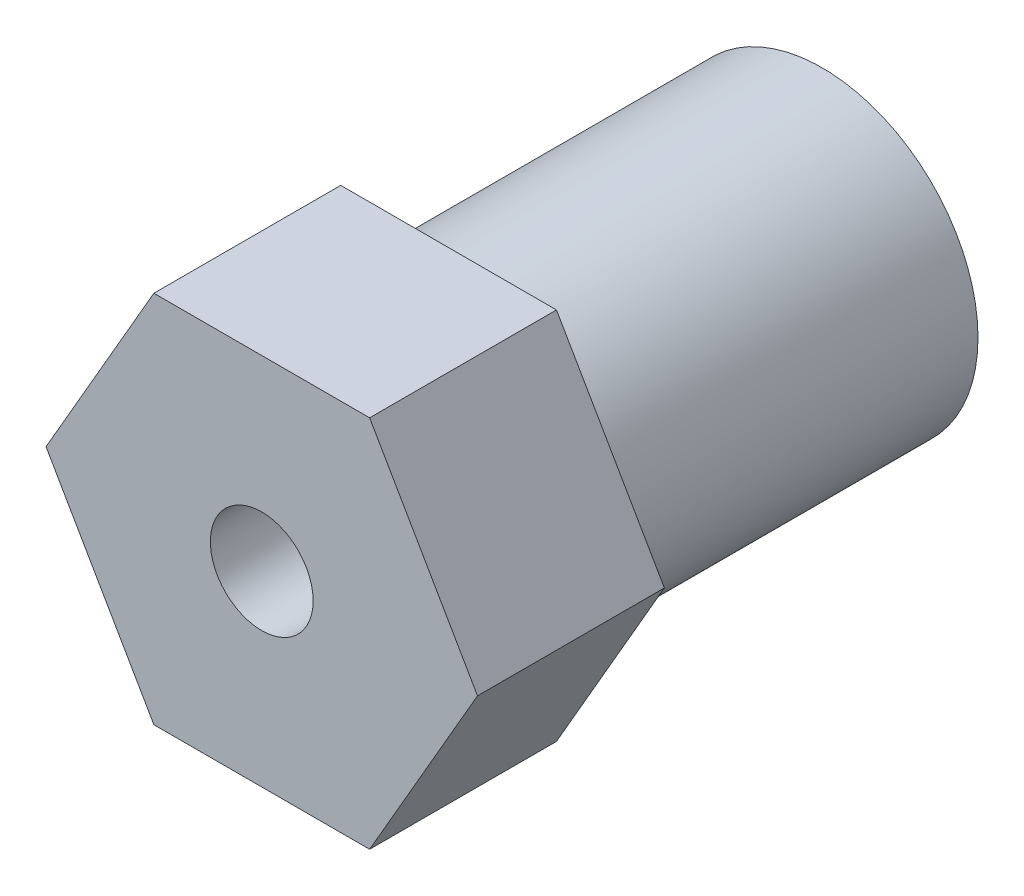
ISO-10303-21;
HEADER;
FILE_DESCRIPTION(('STEP AP214'),'2;1');
FILE_NAME('part.step','',(''),(''),'','','');
FILE_SCHEMA(('AUTOMOTIVE_DESIGN { 1 0 10303 214 1 1 1 1 }'));
ENDSEC;
DATA;
#1=APPLICATION_CONTEXT('core data for automotive mechanical design processes');
#2=APPLICATION_PROTOCOL_DEFINITION('international standard','automotive_design',2000,#1);
#3=PRODUCT_CONTEXT('',#1,'mechanical');
#4=PRODUCT('Part','Part','',(#3));
#5=PRODUCT_RELATED_PRODUCT_CATEGORY('part','',(#4));
#6=PRODUCT_DEFINITION_FORMATION('','',#4);
#7=PRODUCT_DEFINITION_CONTEXT('part definition',#1,'design');
#8=PRODUCT_DEFINITION('design','',#6,#7);
#9=PRODUCT_DEFINITION_SHAPE('','',#8);
#10=(LENGTH_UNIT() NAMED_UNIT(*) SI_UNIT(.MILLI.,.METRE.));
#11=(NAMED_UNIT(*) PLANE_ANGLE_UNIT() SI_UNIT($,.RADIAN.));
#12=(NAMED_UNIT(*) SI_UNIT($,.STERADIAN.) SOLID_ANGLE_UNIT());
#13=UNCERTAINTY_MEASURE_WITH_UNIT(LENGTH_MEASURE(1.E-05),#10,'distance_accuracy_value','');
#14=(GEOMETRIC_REPRESENTATION_CONTEXT(3) GLOBAL_UNCERTAINTY_ASSIGNED_CONTEXT((#13)) GLOBAL_UNIT_ASSIGNED_CONTEXT((#10,
#11,#12)) REPRESENTATION_CONTEXT('',''));
#15=CARTESIAN_POINT('',(0.,0.,0.));
#16=DIRECTION('',(0.,0.,1.));
#17=DIRECTION('',(1.,0.,0.));
#18=AXIS2_PLACEMENT_3D('',#15,#16,#17);
#19=CARTESIAN_POINT('',(3.46410161513782,-5.99999999999996,6.));
#20=DIRECTION('',(-0.866025403784441,0.499999999999995,0.));
#21=DIRECTION('',(-0.499999999999995,-0.866025403784442,0.));
#22=AXIS2_PLACEMENT_3D('',#19,#20,#21);
#23=PLANE('',#22);
#24=DIRECTION('',(0.499999999999995,0.866025403784442,0.));
#25=VECTOR('',#24,1.);
#26=CARTESIAN_POINT('',(3.46410161513782,-5.99999999999996,0.));
#27=LINE('',#26,#25);
#28=CARTESIAN_POINT('',(3.46410161513782,-5.99999999999996,0.));
#29=VERTEX_POINT('',#28);
#30=CARTESIAN_POINT('',(6.92820323027551,0.,0.));
#31=VERTEX_POINT('',#30);
#32=EDGE_CURVE('E126',#29,#31,#27,.T.);
#33=ORIENTED_EDGE('',*,*,#32,.T.);
#34=DIRECTION('',(0.,0.,-1.));
#35=VECTOR('',#34,1.);
#36=CARTESIAN_POINT('',(6.92820323027551,0.,6.));
#37=LINE('',#36,#35);
#38=CARTESIAN_POINT('',(6.92820323027551,0.,6.));
#39=VERTEX_POINT('',#38);
#40=EDGE_CURVE('E11',#39,#31,#37,.T.);
#41=ORIENTED_EDGE('',*,*,#40,.F.);
#42=DIRECTION('',(0.499999999999995,0.866025403784442,0.));
#43=VECTOR('',#42,1.);
#44=CARTESIAN_POINT('',(3.46410161513782,-5.99999999999996,6.));
#45=LINE('',#44,#43);
#46=CARTESIAN_POINT('',(3.46410161513782,-5.99999999999996,6.));
#47=VERTEX_POINT('',#46);
#48=EDGE_CURVE('E139',#47,#39,#45,.T.);
#49=ORIENTED_EDGE('',*,*,#48,.F.);
#50=DIRECTION('',(0.,0.,-1.));
#51=VECTOR('',#50,1.);
#52=CARTESIAN_POINT('',(3.46410161513782,-5.99999999999996,6.));
#53=LINE('',#52,#51);
#54=EDGE_CURVE('E123',#47,#29,#53,.T.);
#55=ORIENTED_EDGE('',*,*,#54,.T.);
#56=EDGE_LOOP('',(#33,#41,#49,#55));
#57=FACE_BOUND('',#56,.T.);
#58=ADVANCED_FACE('F39',(#57),#23,.F.);
#59=CARTESIAN_POINT('',(6.92820323027551,0.,6.));
#60=DIRECTION('',(-0.866025403784438,-0.500000000000001,0.));
#61=DIRECTION('',(0.500000000000001,-0.866025403784438,0.));
#62=AXIS2_PLACEMENT_3D('',#59,#60,#61);
#63=PLANE('',#62);
#64=DIRECTION('',(-0.500000000000001,0.866025403784438,0.));
#65=VECTOR('',#64,1.);
#66=CARTESIAN_POINT('',(6.92820323027551,0.,0.));
#67=LINE('',#66,#65);
#68=CARTESIAN_POINT('',(3.46410161513774,6.00000000000001,0.));
#69=VERTEX_POINT('',#68);
#70=EDGE_CURVE('E134',#31,#69,#67,.T.);
#71=ORIENTED_EDGE('',*,*,#70,.T.);
#72=DIRECTION('',(0.,0.,-1.));
#73=VECTOR('',#72,1.);
#74=CARTESIAN_POINT('',(3.46410161513774,6.00000000000001,6.));
#75=LINE('',#74,#73);
#76=CARTESIAN_POINT('',(3.46410161513774,6.00000000000001,6.));
#77=VERTEX_POINT('',#76);
#78=EDGE_CURVE('E52',#77,#69,#75,.T.);
#79=ORIENTED_EDGE('',*,*,#78,.F.);
#80=DIRECTION('',(-0.500000000000001,0.866025403784438,0.));
#81=VECTOR('',#80,1.);
#82=CARTESIAN_POINT('',(6.92820323027551,0.,6.));
#83=LINE('',#82,#81);
#84=EDGE_CURVE('E96',#39,#77,#83,.T.);
#85=ORIENTED_EDGE('',*,*,#84,.F.);
#86=ORIENTED_EDGE('',*,*,#40,.T.);
#87=EDGE_LOOP('',(#71,#79,#85,#86));
#88=FACE_BOUND('',#87,.T.);
#89=ADVANCED_FACE('F170',(#88),#63,.F.);
#90=CARTESIAN_POINT('',(3.46410161513774,6.00000000000001,6.));
#91=DIRECTION('',(0.,-1.,0.));
#92=DIRECTION('',(1.,0.,0.));
#93=AXIS2_PLACEMENT_3D('',#90,#91,#92);
#94=PLANE('',#93);
#95=DIRECTION('',(-1.,0.,0.));
#96=VECTOR('',#95,1.);
#97=CARTESIAN_POINT('',(3.46410161513774,6.00000000000001,0.));
#98=LINE('',#97,#96);
#99=CARTESIAN_POINT('',(-3.46410161513778,5.99999999999998,0.));
#100=VERTEX_POINT('',#99);
#101=EDGE_CURVE('E131',#69,#100,#98,.T.);
#102=ORIENTED_EDGE('',*,*,#101,.T.);
#103=DIRECTION('',(0.,0.,-1.));
#104=VECTOR('',#103,1.);
#105=CARTESIAN_POINT('',(-3.46410161513778,5.99999999999998,6.));
#106=LINE('',#105,#104);
#107=CARTESIAN_POINT('',(-3.46410161513778,5.99999999999998,6.));
#108=VERTEX_POINT('',#107);
#109=EDGE_CURVE('E119',#108,#100,#106,.T.);
#110=ORIENTED_EDGE('',*,*,#109,.F.);
#111=DIRECTION('',(-1.,0.,0.));
#112=VECTOR('',#111,1.);
#113=CARTESIAN_POINT('',(3.46410161513774,6.00000000000001,6.));
#114=LINE('',#113,#112);
#115=EDGE_CURVE('E111',#77,#108,#114,.T.);
#116=ORIENTED_EDGE('',*,*,#115,.F.);
#117=ORIENTED_EDGE('',*,*,#78,.T.);
#118=EDGE_LOOP('',(#102,#110,#116,#117));
#119=FACE_BOUND('',#118,.T.);
#120=ADVANCED_FACE('F150',(#119),#94,.F.);
#121=CARTESIAN_POINT('',(-3.46410161513778,5.99999999999998,6.));
#122=DIRECTION('',(0.866025403784441,-0.499999999999995,0.));
#123=DIRECTION('',(0.499999999999995,0.866025403784442,0.));
#124=AXIS2_PLACEMENT_3D('',#121,#122,#123);
#125=PLANE('',#124);
#126=DIRECTION('',(-0.499999999999995,-0.866025403784442,0.));
#127=VECTOR('',#126,1.);
#128=CARTESIAN_POINT('',(-3.46410161513778,5.99999999999998,0.));
#129=LINE('',#128,#127);
#130=CARTESIAN_POINT('',(-6.92820323027551,0.,0.));
#131=VERTEX_POINT('',#130);
#132=EDGE_CURVE('E118',#100,#131,#129,.T.);
#133=ORIENTED_EDGE('',*,*,#132,.T.);
#134=DIRECTION('',(0.,0.,-1.));
#135=VECTOR('',#134,1.);
#136=CARTESIAN_POINT('',(-6.92820323027551,0.,6.));
#137=LINE('',#136,#135);
#138=CARTESIAN_POINT('',(-6.92820323027551,0.,6.));
#139=VERTEX_POINT('',#138);
#140=EDGE_CURVE('E116',#139,#131,#137,.T.);
#141=ORIENTED_EDGE('',*,*,#140,.F.);
#142=DIRECTION('',(-0.499999999999995,-0.866025403784442,0.));
#143=VECTOR('',#142,1.);
#144=CARTESIAN_POINT('',(-3.46410161513778,5.99999999999998,6.));
#145=LINE('',#144,#143);
#146=EDGE_CURVE('E102',#108,#139,#145,.T.);
#147=ORIENTED_EDGE('',*,*,#146,.F.);
#148=ORIENTED_EDGE('',*,*,#109,.T.);
#149=EDGE_LOOP('',(#133,#141,#147,#148));
#150=FACE_BOUND('',#149,.T.);
#151=ADVANCED_FACE('F120',(#150),#125,.F.);
#152=CARTESIAN_POINT('',(-6.92820323027551,0.,6.));
#153=DIRECTION('',(0.866025403784435,0.500000000000007,0.));
#154=DIRECTION('',(-0.500000000000007,0.866025403784434,0.));
#155=AXIS2_PLACEMENT_3D('',#152,#153,#154);
#156=PLANE('',#155);
#157=DIRECTION('',(0.500000000000007,-0.866025403784434,0.));
#158=VECTOR('',#157,1.);
#159=CARTESIAN_POINT('',(-6.92820323027551,0.,0.));
#160=LINE('',#159,#158);
#161=CARTESIAN_POINT('',(-3.4641016151377,-6.00000000000003,0.));
#162=VERTEX_POINT('',#161);
#163=EDGE_CURVE('E81',#131,#162,#160,.T.);
#164=ORIENTED_EDGE('',*,*,#163,.T.);
#165=DIRECTION('',(0.,0.,-1.));
#166=VECTOR('',#165,1.);
#167=CARTESIAN_POINT('',(-3.4641016151377,-6.00000000000003,6.));
#168=LINE('',#167,#166);
#169=CARTESIAN_POINT('',(-3.4641016151377,-6.00000000000003,6.));
#170=VERTEX_POINT('',#169);
#171=EDGE_CURVE('E122',#170,#162,#168,.T.);
#172=ORIENTED_EDGE('',*,*,#171,.F.);
#173=DIRECTION('',(0.500000000000007,-0.866025403784434,0.));
#174=VECTOR('',#173,1.);
#175=CARTESIAN_POINT('',(-6.92820323027551,0.,6.));
#176=LINE('',#175,#174);
#177=EDGE_CURVE('E107',#139,#170,#176,.T.);
#178=ORIENTED_EDGE('',*,*,#177,.F.);
#179=ORIENTED_EDGE('',*,*,#140,.T.);
#180=EDGE_LOOP('',(#164,#172,#178,#179));
#181=FACE_BOUND('',#180,.T.);
#182=ADVANCED_FACE('F124',(#181),#156,.F.);
#183=CARTESIAN_POINT('',(-3.4641016151377,-6.00000000000003,6.));
#184=DIRECTION('',(0.,1.,0.));
#185=DIRECTION('',(-1.,0.,0.));
#186=AXIS2_PLACEMENT_3D('',#183,#184,#185);
#187=PLANE('',#186);
#188=DIRECTION('',(1.,0.,0.));
#189=VECTOR('',#188,1.);
#190=CARTESIAN_POINT('',(-3.4641016151377,-6.00000000000003,0.));
#191=LINE('',#190,#189);
#192=EDGE_CURVE('E86',#162,#29,#191,.T.);
#193=ORIENTED_EDGE('',*,*,#192,.T.);
#194=ORIENTED_EDGE('',*,*,#54,.F.);
#195=DIRECTION('',(1.,0.,0.));
#196=VECTOR('',#195,1.);
#197=CARTESIAN_POINT('',(-3.4641016151377,-6.00000000000003,6.));
#198=LINE('',#197,#196);
#199=EDGE_CURVE('E62',#170,#47,#198,.T.);
#200=ORIENTED_EDGE('',*,*,#199,.F.);
#201=ORIENTED_EDGE('',*,*,#171,.T.);
#202=EDGE_LOOP('',(#193,#194,#200,#201));
#203=FACE_BOUND('',#202,.T.);
#204=ADVANCED_FACE('F155',(#203),#187,.F.);
#205=CARTESIAN_POINT('',(0.,0.,6.));
#206=DIRECTION('',(0.,0.,1.));
#207=DIRECTION('',(1.,0.,0.));
#208=AXIS2_PLACEMENT_3D('',#205,#206,#207);
#209=PLANE('',#208);
#210=CARTESIAN_POINT('',(0.,0.,6.));
#211=DIRECTION('',(0.,0.,1.));
#212=DIRECTION('',(1.,0.,0.));
#213=AXIS2_PLACEMENT_3D('',#210,#211,#212);
#214=CIRCLE('',#213,1.65);
#215=CARTESIAN_POINT('',(1.65,0.,6.));
#216=VERTEX_POINT('',#215);
#217=EDGE_CURVE('E277',#216,#216,#214,.T.);
#218=ORIENTED_EDGE('',*,*,#217,.F.);
#219=EDGE_LOOP('',(#218));
#220=FACE_BOUND('',#219,.T.);
#221=ORIENTED_EDGE('',*,*,#48,.T.);
#222=ORIENTED_EDGE('',*,*,#84,.T.);
#223=ORIENTED_EDGE('',*,*,#115,.T.);
#224=ORIENTED_EDGE('',*,*,#146,.T.);
#225=ORIENTED_EDGE('',*,*,#177,.T.);
#226=ORIENTED_EDGE('',*,*,#199,.T.);
#227=EDGE_LOOP('',(#221,#222,#223,#224,#225,#226));
#228=FACE_BOUND('',#227,.T.);
#229=ADVANCED_FACE('F110',(#220,#228),#209,.T.);
#230=CARTESIAN_POINT('',(0.,0.,0.));
#231=DIRECTION('',(0.,0.,1.));
#232=DIRECTION('',(1.,0.,0.));
#233=AXIS2_PLACEMENT_3D('',#230,#231,#232);
#234=PLANE('',#233);
#235=CARTESIAN_POINT('',(0.,0.,0.));
#236=DIRECTION('',(0.,0.,1.));
#237=DIRECTION('',(1.,0.,0.));
#238=AXIS2_PLACEMENT_3D('',#235,#236,#237);
#239=CIRCLE('',#238,5.);
#240=CARTESIAN_POINT('',(5.,0.,0.));
#241=VERTEX_POINT('',#240);
#242=EDGE_CURVE('E290',#241,#241,#239,.T.);
#243=ORIENTED_EDGE('',*,*,#242,.T.);
#244=EDGE_LOOP('',(#243));
#245=FACE_BOUND('',#244,.T.);
#246=ORIENTED_EDGE('',*,*,#32,.F.);
#247=ORIENTED_EDGE('',*,*,#192,.F.);
#248=ORIENTED_EDGE('',*,*,#163,.F.);
#249=ORIENTED_EDGE('',*,*,#132,.F.);
#250=ORIENTED_EDGE('',*,*,#101,.F.);
#251=ORIENTED_EDGE('',*,*,#70,.F.);
#252=EDGE_LOOP('',(#246,#247,#248,#249,#250,#251));
#253=FACE_BOUND('',#252,.T.);
#254=ADVANCED_FACE('F148',(#245,#253),#234,.F.);
#255=CARTESIAN_POINT('',(0.,0.,-12.));
#256=DIRECTION('',(0.,0.,1.));
#257=DIRECTION('',(1.,0.,0.));
#258=AXIS2_PLACEMENT_3D('',#255,#256,#257);
#259=CYLINDRICAL_SURFACE('',#258,5.);
#260=CARTESIAN_POINT('',(0.,-5.,-7.75));
#261=CARTESIAN_POINT('',(-0.0690634072247758,-4.99999883223344,-7.75000193811513));
#262=CARTESIAN_POINT('',(-0.138148464858969,-4.99855481776523,-7.75574295897816));
#263=CARTESIAN_POINT('',(-0.27433860314211,-4.99293428191577,-7.7785209594225));
#264=CARTESIAN_POINT('',(-0.341442539058949,-4.98875621183307,-7.79556434128154));
#265=CARTESIAN_POINT('',(-0.471684060152147,-4.97813021943366,-7.84036604455174));
#266=CARTESIAN_POINT('',(-0.534826302858336,-4.97168502368406,-7.8681114989294));
#267=CARTESIAN_POINT('',(-0.655560109920355,-4.95721119839661,-7.93348449170403));
#268=CARTESIAN_POINT('',(-0.7131514869573,-4.94918251545042,-7.97111236343245));
#269=CARTESIAN_POINT('',(-0.822334939417433,-4.93222844659834,-8.05600065804517));
#270=CARTESIAN_POINT('',(-0.873796408384226,-4.92328922623777,-8.10342631246598));
#271=CARTESIAN_POINT('',(-0.968124106002753,-4.90561350097941,-8.20621017075743));
#272=CARTESIAN_POINT('',(-1.01098936412428,-4.89687701906957,-8.26156926912208));
#273=CARTESIAN_POINT('',(-1.08752211899919,-4.88045646416425,-8.37966268894787));
#274=CARTESIAN_POINT('',(-1.12104351327113,-4.87278995392171,-8.44249435900867));
#275=CARTESIAN_POINT('',(-1.17699742379211,-4.85957912343519,-8.57312367638197));
#276=CARTESIAN_POINT('',(-1.19943171286611,-4.85403446393991,-8.64092052777147));
#277=CARTESIAN_POINT('',(-1.23212903067024,-4.84583730597959,-8.7781195818354));
#278=CARTESIAN_POINT('',(-1.24262689027778,-4.84312909229522,-8.84746241337483));
#279=CARTESIAN_POINT('',(-1.25188481255654,-4.84074468781451,-8.98697380751165));
#280=CARTESIAN_POINT('',(-1.25064678484831,-4.8410680037387,-9.05714223391551));
#281=CARTESIAN_POINT('',(-1.2366554371994,-4.84466004580515,-9.1945131731204));
#282=CARTESIAN_POINT('',(-1.22418195015877,-4.84785719168233,-9.26174635122092));
#283=CARTESIAN_POINT('',(-1.18852015575259,-4.85672258063736,-9.39313420909275));
#284=CARTESIAN_POINT('',(-1.16533108505785,-4.8623909997558,-9.45728866919082));
#285=CARTESIAN_POINT('',(-1.10865789828096,-4.87562594920156,-9.58144834687672));
#286=CARTESIAN_POINT('',(-1.07507222269409,-4.88321106224518,-9.64140514315796));
#287=CARTESIAN_POINT('',(-0.998630230012461,-4.89941425705322,-9.7549322581307));
#288=CARTESIAN_POINT('',(-0.955772290674032,-4.90803251945613,-9.80850145672271));
#289=CARTESIAN_POINT('',(-0.860552853901015,-4.92563233783151,-9.909336346412));
#290=CARTESIAN_POINT('',(-0.807955215138216,-4.93461724564976,-9.95637874171779));
#291=CARTESIAN_POINT('',(-0.695509931253083,-4.95171637982321,-10.0410177020533));
#292=CARTESIAN_POINT('',(-0.635662064756619,-4.95983057957846,-10.078613978553));
#293=CARTESIAN_POINT('',(-0.510096573901159,-4.97431443411819,-10.1433754885203));
#294=CARTESIAN_POINT('',(-0.444359494340519,-4.98067800106438,-10.170504450212));
#295=CARTESIAN_POINT('',(-0.309063340119069,-4.99089930826182,-10.2132644214246));
#296=CARTESIAN_POINT('',(-0.239504999292071,-4.99475752782734,-10.2288976303484));
#297=CARTESIAN_POINT('',(-0.100449975325022,-4.99946249392812,-10.2478813046324));
#298=CARTESIAN_POINT('',(-0.0309972666568413,-5.00038377923565,-10.2515358550628));
#299=CARTESIAN_POINT('',(0.107527395667924,-4.99932337345376,-10.2472924982871));
#300=CARTESIAN_POINT('',(0.176599383037163,-4.99734194368205,-10.2393956310007));
#301=CARTESIAN_POINT('',(0.31134522398041,-4.99074650939464,-10.2125242430072));
#302=CARTESIAN_POINT('',(0.377054265807296,-4.98617195154843,-10.1937156137692));
#303=CARTESIAN_POINT('',(0.50438107704376,-4.97490588861778,-10.145744096643));
#304=CARTESIAN_POINT('',(0.565998432527196,-4.9682141697491,-10.1165801630724));
#305=CARTESIAN_POINT('',(0.684602612024873,-4.95327756605259,-10.0481365592711));
#306=CARTESIAN_POINT('',(0.741487868196525,-4.94500722805777,-10.0086865730027));
#307=CARTESIAN_POINT('',(0.847938844702705,-4.92787090989516,-9.92100840933586));
#308=CARTESIAN_POINT('',(0.897503299144173,-4.91900482709754,-9.87277871698591));
#309=CARTESIAN_POINT('',(0.989158806727275,-4.90140797467309,-9.76749836596295));
#310=CARTESIAN_POINT('',(1.03103655635169,-4.89268586822734,-9.71026024749798));
#311=CARTESIAN_POINT('',(1.10459229917725,-4.87660731981032,-9.58938947127857));
#312=CARTESIAN_POINT('',(1.13627074513161,-4.86925081722522,-9.52575709753354));
#313=CARTESIAN_POINT('',(1.18829285050774,-4.85681745612221,-9.39424523132243));
#314=CARTESIAN_POINT('',(1.20870366387839,-4.85172712743255,-9.32639364304666));
#315=CARTESIAN_POINT('',(1.23778804996148,-4.84438953408486,-9.18807530175907));
#316=CARTESIAN_POINT('',(1.24646418956555,-4.84214164766613,-9.11760912413959));
#317=CARTESIAN_POINT('',(1.25169882527833,-4.84079084336631,-8.97823248012066));
#318=CARTESIAN_POINT('',(1.2485982481501,-4.8415994394022,-8.90933547072939));
#319=CARTESIAN_POINT('',(1.23114773192739,-4.84606590839869,-8.77308009277668));
#320=CARTESIAN_POINT('',(1.21679801890564,-4.84972372409881,-8.70572169332196));
#321=CARTESIAN_POINT('',(1.17744276620233,-4.85942717235602,-8.57482628411216));
#322=CARTESIAN_POINT('',(1.15250117056698,-4.86545846030258,-8.51126891229983));
#323=CARTESIAN_POINT('',(1.09272076133756,-4.8792312977069,-8.38919551440526));
#324=CARTESIAN_POINT('',(1.05788057502849,-4.88697308433977,-8.3306801890109));
#325=CARTESIAN_POINT('',(0.97822312386428,-4.90354695219593,-8.21870447583165));
#326=CARTESIAN_POINT('',(0.933169302426879,-4.91240220693131,-8.1654157721467));
#327=CARTESIAN_POINT('',(0.834824475991446,-4.93006689371905,-8.06704412933716));
#328=CARTESIAN_POINT('',(0.781531517717621,-4.93887631439216,-8.02196314157252));
#329=CARTESIAN_POINT('',(0.667056322252157,-4.95564713039719,-7.94049057619616));
#330=CARTESIAN_POINT('',(0.605748685263654,-4.9635902780489,-7.90427115527368));
#331=CARTESIAN_POINT('',(0.477721716258729,-4.97754104145932,-7.84271044754956));
#332=CARTESIAN_POINT('',(0.411006302863949,-4.98355004333151,-7.81736136612622));
#333=CARTESIAN_POINT('',(0.287008544369559,-4.99206716304618,-7.78202347472529));
#334=CARTESIAN_POINT('',(0.230316809090057,-4.99502154210576,-7.77004063078881));
#335=CARTESIAN_POINT('',(0.115755059613569,-4.9989883769329,-7.75402838031505));
#336=CARTESIAN_POINT('',(0.0578851343688469,-5.00000097875745,-7.74999837557891));
#337=CARTESIAN_POINT('',(0.,-5.,-7.75));
#338=B_SPLINE_CURVE_WITH_KNOTS('',3,(#260,#261,#262,#263,#264,#265,#266,#267,#268,#269,#270,
#271,#272,#273,#274,#275,#276,#277,#278,#279,#280,#281,#282,#283,#284,#285,#286,#287,#288,#289,
#290,#291,#292,#293,#294,#295,#296,#297,#298,#299,#300,#301,#302,#303,#304,#305,#306,#307,#308,
#309,#310,#311,#312,#313,#314,#315,#316,#317,#318,#319,#320,#321,#322,#323,#324,#325,#326,#327,
#328,#329,#330,#331,#332,#333,#334,#335,#336,#337),.UNSPECIFIED.,.T.,.F.,(4,2,2,2,2,2,2,2,2,2,2,
2,2,2,2,2,2,2,2,2,2,2,2,2,2,2,2,2,2,2,2,2,2,2,2,2,2,2,4),(0.,0.206978093726575,
0.414073531469916,0.620920751905088,0.827774950141107,1.03845362864282,1.24915607983385,
1.46298872954839,1.6767871764114,1.88630245916192,2.09578365093914,2.30018747505849,
2.50460586221699,2.71108773228233,2.91760575696802,3.13001250807516,3.34242574631873,
3.55556857507595,3.76867061407202,3.97631924124397,4.18394917593952,4.38850228761698,
4.59307606101909,4.80127989637793,5.00951969173349,5.2228709100373,5.4362126562459,
5.6482687884503,5.8602785271034,6.06619816998844,6.27211367463362,6.47680333799539,
6.68152140114084,6.89157980341592,7.10168808142015,7.3156015458299,7.52936136517792,
7.70285202451791,7.876329633692),.UNSPECIFIED.);
#339=CARTESIAN_POINT('',(0.,-5.,-7.75));
#340=VERTEX_POINT('',#339);
#341=EDGE_CURVE('E269',#340,#340,#338,.T.);
#342=ORIENTED_EDGE('',*,*,#341,.F.);
#343=EDGE_LOOP('',(#342));
#344=FACE_BOUND('',#343,.T.);
#345=CARTESIAN_POINT('',(0.,0.,-12.));
#346=DIRECTION('',(0.,0.,1.));
#347=DIRECTION('',(1.,0.,0.));
#348=AXIS2_PLACEMENT_3D('',#345,#346,#347);
#349=CIRCLE('',#348,5.);
#350=CARTESIAN_POINT('',(5.,0.,-12.));
#351=VERTEX_POINT('',#350);
#352=EDGE_CURVE('E132',#351,#351,#349,.T.);
#353=ORIENTED_EDGE('',*,*,#352,.T.);
#354=EDGE_LOOP('',(#353));
#355=FACE_BOUND('',#354,.T.);
#356=ORIENTED_EDGE('',*,*,#242,.F.);
#357=EDGE_LOOP('',(#356));
#358=FACE_BOUND('',#357,.T.);
#359=ADVANCED_FACE('F210',(#344,#355,#358),#259,.T.);
#360=CARTESIAN_POINT('',(0.,0.,-12.));
#361=DIRECTION('',(0.,0.,1.));
#362=DIRECTION('',(1.,0.,0.));
#363=AXIS2_PLACEMENT_3D('',#360,#361,#362);
#364=PLANE('',#363);
#365=CARTESIAN_POINT('',(0.,0.,-12.));
#366=DIRECTION('',(0.,0.,1.));
#367=DIRECTION('',(1.,0.,0.));
#368=AXIS2_PLACEMENT_3D('',#365,#366,#367);
#369=CIRCLE('',#368,2.5);
#370=CARTESIAN_POINT('',(2.5,0.,-12.));
#371=VERTEX_POINT('',#370);
#372=EDGE_CURVE('E285',#371,#371,#369,.T.);
#373=ORIENTED_EDGE('',*,*,#372,.T.);
#374=EDGE_LOOP('',(#373));
#375=FACE_BOUND('',#374,.T.);
#376=ORIENTED_EDGE('',*,*,#352,.F.);
#377=EDGE_LOOP('',(#376));
#378=FACE_BOUND('',#377,.T.);
#379=ADVANCED_FACE('F218',(#375,#378),#364,.F.);
#380=CARTESIAN_POINT('',(0.,0.,-12.));
#381=DIRECTION('',(0.,0.,1.));
#382=DIRECTION('',(1.,0.,0.));
#383=AXIS2_PLACEMENT_3D('',#380,#381,#382);
#384=CYLINDRICAL_SURFACE('',#383,2.5);
#385=CARTESIAN_POINT('',(0.,-2.5,-7.75));
#386=CARTESIAN_POINT('',(-0.0657149536912331,-2.49999641755189,-7.75000412789937));
#387=CARTESIAN_POINT('',(-0.131508249622541,-2.49738113774397,-7.75521259140209));
#388=CARTESIAN_POINT('',(-0.261150294085531,-2.48717695046745,-7.77581610042615));
#389=CARTESIAN_POINT('',(-0.324995108391879,-2.47957859786229,-7.79123049124706));
#390=CARTESIAN_POINT('',(-0.448666931100718,-2.46020349254139,-7.83149226077099));
#391=CARTESIAN_POINT('',(-0.508508503673975,-2.448442989719,-7.85630298031001));
#392=CARTESIAN_POINT('',(-0.623090771008206,-2.42182220644723,-7.91446327670617));
#393=CARTESIAN_POINT('',(-0.677831867487562,-2.40696217041913,-7.94781218031106));
#394=CARTESIAN_POINT('',(-0.784384772202399,-2.37445322822571,-8.02439656185662));
#395=CARTESIAN_POINT('',(-0.83581901390264,-2.3566899890942,-8.06810809904955));
#396=CARTESIAN_POINT('',(-0.930974306083722,-2.3207496280843,-8.16315184905879));
#397=CARTESIAN_POINT('',(-0.974689478883458,-2.30257220261294,-8.21448981471555));
#398=CARTESIAN_POINT('',(-1.05656500056285,-2.26623688996684,-8.32810418690423));
#399=CARTESIAN_POINT('',(-1.09403166943955,-2.24818983712665,-8.39092012293239));
#400=CARTESIAN_POINT('',(-1.15771028361337,-2.21607473465401,-8.52295916998277));
#401=CARTESIAN_POINT('',(-1.18393026870792,-2.20200384508737,-8.59217766090344));
#402=CARTESIAN_POINT('',(-1.22266555273574,-2.18072333797261,-8.7308313817774));
#403=CARTESIAN_POINT('',(-1.23590732135055,-2.17315339479642,-8.80000556508424));
#404=CARTESIAN_POINT('',(-1.25053374163606,-2.1647736243566,-8.93997354722435));
#405=CARTESIAN_POINT('',(-1.25193011046634,-2.1639571167911,-9.01076567608894));
#406=CARTESIAN_POINT('',(-1.24335910896537,-2.16888662821561,-9.14285753039421));
#407=CARTESIAN_POINT('',(-1.23473069942103,-2.17385954577517,-9.20428003902881));
#408=CARTESIAN_POINT('',(-1.20867481132117,-2.18845285917313,-9.3246523867163));
#409=CARTESIAN_POINT('',(-1.19124452987206,-2.1980747353972,-9.38360143163164));
#410=CARTESIAN_POINT('',(-1.1477622254825,-2.22109345515926,-9.49903641570707));
#411=CARTESIAN_POINT('',(-1.12151883389499,-2.23457300829998,-9.55543299848223));
#412=CARTESIAN_POINT('',(-1.061302109585,-2.26379255351754,-9.66329286573751));
#413=CARTESIAN_POINT('',(-1.02732530476558,-2.27953355975238,-9.71475391950011));
#414=CARTESIAN_POINT('',(-0.947582568640986,-2.31391447379107,-9.81815156592903));
#415=CARTESIAN_POINT('',(-0.900868072961603,-2.33266887795933,-9.8693210919702));
#416=CARTESIAN_POINT('',(-0.799444473426717,-2.36934529125509,-9.96341927323863));
#417=CARTESIAN_POINT('',(-0.744731570717857,-2.38726689948501,-10.0063439900424));
#418=CARTESIAN_POINT('',(-0.62564563228981,-2.42127484103705,-10.0846070762872));
#419=CARTESIAN_POINT('',(-0.56094198949926,-2.43723730202509,-10.1195005905572));
#420=CARTESIAN_POINT('',(-0.425582769360995,-2.46447351401553,-10.1776212863038));
#421=CARTESIAN_POINT('',(-0.354931970331595,-2.47575098679441,-10.200857731269));
#422=CARTESIAN_POINT('',(-0.215958114575876,-2.49155417176795,-10.2330942546458));
#423=CARTESIAN_POINT('',(-0.147926913185405,-2.4965617287664,-10.2431140446835));
#424=CARTESIAN_POINT('',(-0.0109744999366916,-2.50091266823877,-10.2518309139181));
#425=CARTESIAN_POINT('',(0.0579462748373771,-2.5002587340164,-10.2505333570493));
#426=CARTESIAN_POINT('',(0.189041214982492,-2.49363990316801,-10.2372416394766));
#427=CARTESIAN_POINT('',(0.251324260062443,-2.48809057110237,-10.2260843340875));
#428=CARTESIAN_POINT('',(0.373008615377396,-2.47277714143524,-10.1947024101311));
#429=CARTESIAN_POINT('',(0.432409607113746,-2.46301257917916,-10.1744767919333));
#430=CARTESIAN_POINT('',(0.548610760562082,-2.43980314267087,-10.1250019169585));
#431=CARTESIAN_POINT('',(0.605287996257692,-2.42626102212424,-10.095511187354));
#432=CARTESIAN_POINT('',(0.713076702123651,-2.39679967896386,-10.0286155804424));
#433=CARTESIAN_POINT('',(0.764185787219102,-2.38087944457231,-9.99120733175821));
#434=CARTESIAN_POINT('',(0.864709611613316,-2.34635276671831,-9.90529946833391));
#435=CARTESIAN_POINT('',(0.913465097280799,-2.32763606060552,-9.85607141443304));
#436=CARTESIAN_POINT('',(1.00232040139155,-2.29077989504843,-9.75009356091337));
#437=CARTESIAN_POINT('',(1.04241423211355,-2.27264084226908,-9.69333860147953));
#438=CARTESIAN_POINT('',(1.11463489312212,-2.23813990282585,-9.57044543224961));
#439=CARTESIAN_POINT('',(1.1462818698483,-2.2219066207934,-9.50398591723926));
#440=CARTESIAN_POINT('',(1.19760353251725,-2.19467590460158,-9.36561241538435));
#441=CARTESIAN_POINT('',(1.21729364485946,-2.18367172800773,-9.29370559187352));
#442=CARTESIAN_POINT('',(1.2423271093121,-2.16951876260833,-9.15386222142319));
#443=CARTESIAN_POINT('',(1.24886624550108,-2.16571729325614,-9.08620718321371));
#444=CARTESIAN_POINT('',(1.25086144297598,-2.16456693307719,-8.95069116603659));
#445=CARTESIAN_POINT('',(1.2463223082805,-2.16721524534441,-8.88283028907571));
#446=CARTESIAN_POINT('',(1.22740765699033,-2.17797327562531,-8.75564562308498));
#447=CARTESIAN_POINT('',(1.2140103929285,-2.18553868102992,-8.6961244123195));
#448=CARTESIAN_POINT('',(1.17896919778081,-2.20463770234897,-8.58023985071912));
#449=CARTESIAN_POINT('',(1.15732261394976,-2.21617259462094,-8.52387752238504));
#450=CARTESIAN_POINT('',(1.10476968162585,-2.2428566295566,-8.41171893626674));
#451=CARTESIAN_POINT('',(1.07333892227057,-2.25819652995238,-8.35621512271288));
#452=CARTESIAN_POINT('',(1.00268871454579,-2.29044164543238,-8.25090682977427));
#453=CARTESIAN_POINT('',(0.963465214048311,-2.30734767243153,-8.20110533685189));
#454=CARTESIAN_POINT('',(0.872754158330802,-2.34327903949141,-8.10232252205298));
#455=CARTESIAN_POINT('',(0.820355528762715,-2.36231229139336,-8.0541761220476));
#456=CARTESIAN_POINT('',(0.70769350777535,-2.3984719031886,-7.96717127072046));
#457=CARTESIAN_POINT('',(0.647425904070982,-2.4155972326005,-7.92831782571714));
#458=CARTESIAN_POINT('',(0.519914496024934,-2.44622511981379,-7.86095454654725));
#459=CARTESIAN_POINT('',(0.452624379918268,-2.45970120703636,-7.83251978823571));
#460=CARTESIAN_POINT('',(0.313427626617739,-2.48126676704332,-7.78773979010131));
#461=CARTESIAN_POINT('',(0.241534749528958,-2.48937154216165,-7.77136019146303));
#462=CARTESIAN_POINT('',(0.14075243310423,-2.49619327387079,-7.75762823615519));
#463=CARTESIAN_POINT('',(0.112702349299373,-2.49761706674002,-7.75477169892048));
#464=CARTESIAN_POINT('',(0.0564396647589471,-2.49952121222331,-7.75095666810399));
#465=CARTESIAN_POINT('',(0.0282270595592268,-2.50000153879704,-7.749998226911));
#466=CARTESIAN_POINT('',(0.,-2.5,-7.75));
#467=B_SPLINE_CURVE_WITH_KNOTS('',3,(#385,#386,#387,#388,#389,#390,#391,#392,#393,#394,#395,
#396,#397,#398,#399,#400,#401,#402,#403,#404,#405,#406,#407,#408,#409,#410,#411,#412,#413,#414,
#415,#416,#417,#418,#419,#420,#421,#422,#423,#424,#425,#426,#427,#428,#429,#430,#431,#432,#433,
#434,#435,#436,#437,#438,#439,#440,#441,#442,#443,#444,#445,#446,#447,#448,#449,#450,#451,#452,
#453,#454,#455,#456,#457,#458,#459,#460,#461,#462,#463,#464,#465,#466),.UNSPECIFIED.,.T.,.F.,(4,
2,2,2,2,2,2,2,2,2,2,2,2,2,2,2,2,2,2,2,2,2,2,2,2,2,2,2,2,2,2,2,2,2,2,2,2,2,2,2,4),(0.,
0.197030321775366,0.394435187136497,0.591077694365372,0.78770470072696,0.996227198397611,
1.20490779706754,1.42977158038441,1.65447434872851,1.86572515175287,2.07676696661276,
2.26257140511651,2.44843504907098,2.63862800210609,2.82890651575277,3.04331176667348,
3.25781918248358,3.48228777768051,3.7065777114035,3.91229113089182,4.11790705639345,
4.30758633132653,4.49728652038664,4.69241070034873,4.88761813435424,5.10199513305524,
5.3165198576929,5.54143352699593,5.76605639925972,5.96911634372967,6.17208824825007,
6.35572412805229,6.53941910979597,6.73545570969518,6.93159451423697,7.15156553440623,
7.37165479220716,7.59330017078656,7.81431135781163,7.89894100172122,7.98357298143558),.UNSPECIFIED.);
#468=CARTESIAN_POINT('',(0.,-2.5,-7.75));
#469=VERTEX_POINT('',#468);
#470=EDGE_CURVE('E45',#469,#469,#467,.T.);
#471=ORIENTED_EDGE('',*,*,#470,.T.);
#472=EDGE_LOOP('',(#471));
#473=FACE_BOUND('',#472,.T.);
#474=ORIENTED_EDGE('',*,*,#372,.F.);
#475=EDGE_LOOP('',(#474));
#476=FACE_BOUND('',#475,.T.);
#477=CARTESIAN_POINT('',(0.,0.,0.));
#478=DIRECTION('',(0.,0.,1.));
#479=DIRECTION('',(1.,0.,0.));
#480=AXIS2_PLACEMENT_3D('',#477,#478,#479);
#481=CIRCLE('',#480,2.5);
#482=CARTESIAN_POINT('',(2.5,0.,0.));
#483=VERTEX_POINT('',#482);
#484=EDGE_CURVE('E283',#483,#483,#481,.T.);
#485=ORIENTED_EDGE('',*,*,#484,.T.);
#486=EDGE_LOOP('',(#485));
#487=FACE_BOUND('',#486,.T.);
#488=ADVANCED_FACE('F227',(#473,#476,#487),#384,.F.);
#489=CARTESIAN_POINT('',(0.,0.,0.));
#490=DIRECTION('',(0.,0.,1.));
#491=DIRECTION('',(1.,0.,0.));
#492=AXIS2_PLACEMENT_3D('',#489,#490,#491);
#493=PLANE('',#492);
#494=CARTESIAN_POINT('',(0.,0.,0.));
#495=DIRECTION('',(0.,0.,1.));
#496=DIRECTION('',(1.,0.,0.));
#497=AXIS2_PLACEMENT_3D('',#494,#495,#496);
#498=CIRCLE('',#497,1.65);
#499=CARTESIAN_POINT('',(1.65,0.,0.));
#500=VERTEX_POINT('',#499);
#501=EDGE_CURVE('E273',#500,#500,#498,.T.);
#502=ORIENTED_EDGE('',*,*,#501,.T.);
#503=EDGE_LOOP('',(#502));
#504=FACE_BOUND('',#503,.T.);
#505=ORIENTED_EDGE('',*,*,#484,.F.);
#506=EDGE_LOOP('',(#505));
#507=FACE_BOUND('',#506,.T.);
#508=ADVANCED_FACE('F236',(#504,#507),#493,.F.);
#509=CARTESIAN_POINT('',(0.,0.,6.));
#510=DIRECTION('',(0.,0.,-1.));
#511=DIRECTION('',(-1.,0.,0.));
#512=AXIS2_PLACEMENT_3D('',#509,#510,#511);
#513=CYLINDRICAL_SURFACE('',#512,1.65);
#514=ORIENTED_EDGE('',*,*,#217,.T.);
#515=EDGE_LOOP('',(#514));
#516=FACE_BOUND('',#515,.T.);
#517=ORIENTED_EDGE('',*,*,#501,.F.);
#518=EDGE_LOOP('',(#517));
#519=FACE_BOUND('',#518,.T.);
#520=ADVANCED_FACE('F244',(#516,#519),#513,.F.);
#521=CARTESIAN_POINT('',(0.,-5.1,-9.));
#522=DIRECTION('',(0.,1.,0.));
#523=DIRECTION('',(0.,0.,1.));
#524=AXIS2_PLACEMENT_3D('',#521,#522,#523);
#525=CYLINDRICAL_SURFACE('',#524,1.25);
#526=ORIENTED_EDGE('',*,*,#341,.T.);
#527=EDGE_LOOP('',(#526));
#528=FACE_BOUND('',#527,.T.);
#529=ORIENTED_EDGE('',*,*,#470,.F.);
#530=EDGE_LOOP('',(#529));
#531=FACE_BOUND('',#530,.T.);
#532=ADVANCED_FACE('F251',(#528,#531),#525,.F.);
#533=CLOSED_SHELL('',(#58,#89,#120,#151,#182,#204,#229,#254,#359,#379,#488,#508,#520,#532));
#534=MANIFOLD_SOLID_BREP('B2',#533);
#535=ADVANCED_BREP_SHAPE_REPRESENTATION('',(#18,#534),#14);
#536=SHAPE_DEFINITION_REPRESENTATION(#9,#535);
ENDSEC;
END-ISO-10303-21;
